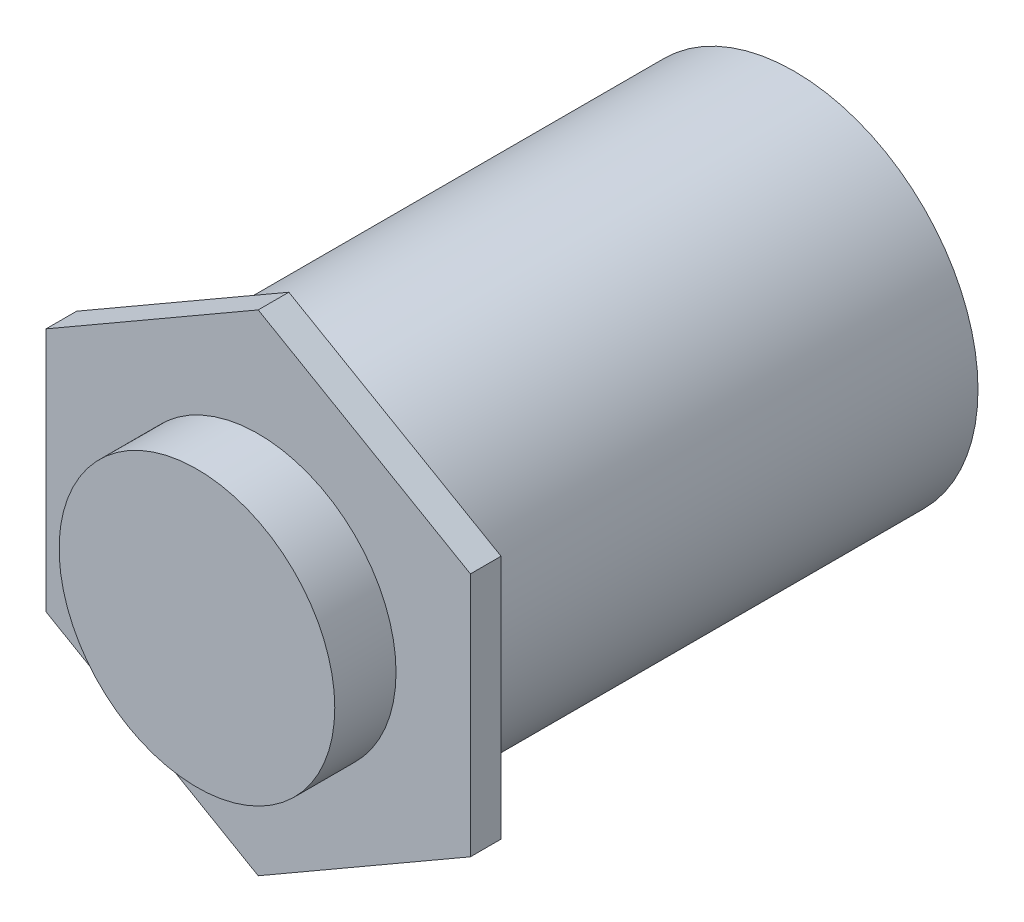
ISO-10303-21;
HEADER;
FILE_DESCRIPTION(('STEP AP214'),'2;1');
FILE_NAME('part.step','',(''),(''),'','','');
FILE_SCHEMA(('AUTOMOTIVE_DESIGN { 1 0 10303 214 1 1 1 1 }'));
ENDSEC;
DATA;
#1=APPLICATION_CONTEXT('core data for automotive mechanical design processes');
#2=APPLICATION_PROTOCOL_DEFINITION('international standard','automotive_design',2000,#1);
#3=PRODUCT_CONTEXT('',#1,'mechanical');
#4=PRODUCT('Part','Part','',(#3));
#5=PRODUCT_RELATED_PRODUCT_CATEGORY('part','',(#4));
#6=PRODUCT_DEFINITION_FORMATION('','',#4);
#7=PRODUCT_DEFINITION_CONTEXT('part definition',#1,'design');
#8=PRODUCT_DEFINITION('design','',#6,#7);
#9=PRODUCT_DEFINITION_SHAPE('','',#8);
#10=(LENGTH_UNIT() NAMED_UNIT(*) SI_UNIT(.MILLI.,.METRE.));
#11=(NAMED_UNIT(*) PLANE_ANGLE_UNIT() SI_UNIT($,.RADIAN.));
#12=(NAMED_UNIT(*) SI_UNIT($,.STERADIAN.) SOLID_ANGLE_UNIT());
#13=UNCERTAINTY_MEASURE_WITH_UNIT(LENGTH_MEASURE(1.E-05),#10,'distance_accuracy_value','');
#14=(GEOMETRIC_REPRESENTATION_CONTEXT(3) GLOBAL_UNCERTAINTY_ASSIGNED_CONTEXT((#13)) GLOBAL_UNIT_ASSIGNED_CONTEXT((#10,
#11,#12)) REPRESENTATION_CONTEXT('',''));
#15=CARTESIAN_POINT('',(0.,0.,0.));
#16=DIRECTION('',(0.,0.,1.));
#17=DIRECTION('',(1.,0.,0.));
#18=AXIS2_PLACEMENT_3D('',#15,#16,#17);
#19=CARTESIAN_POINT('',(0.,0.,16.5));
#20=DIRECTION('',(0.,0.,-1.));
#21=DIRECTION('',(-1.,0.,0.));
#22=AXIS2_PLACEMENT_3D('',#19,#20,#21);
#23=CYLINDRICAL_SURFACE('',#22,6.);
#24=CARTESIAN_POINT('',(0.,0.,16.5));
#25=DIRECTION('',(0.,0.,1.));
#26=DIRECTION('',(1.,0.,0.));
#27=AXIS2_PLACEMENT_3D('',#24,#25,#26);
#28=CIRCLE('',#27,6.);
#29=CARTESIAN_POINT('',(6.,0.,16.5));
#30=VERTEX_POINT('',#29);
#31=EDGE_CURVE('E52',#30,#30,#28,.T.);
#32=ORIENTED_EDGE('',*,*,#31,.F.);
#33=EDGE_LOOP('',(#32));
#34=FACE_BOUND('',#33,.T.);
#35=CARTESIAN_POINT('',(0.,0.,0.));
#36=DIRECTION('',(0.,0.,1.));
#37=DIRECTION('',(1.,0.,0.));
#38=AXIS2_PLACEMENT_3D('',#35,#36,#37);
#39=CIRCLE('',#38,6.);
#40=CARTESIAN_POINT('',(6.,0.,0.));
#41=VERTEX_POINT('',#40);
#42=EDGE_CURVE('E46',#41,#41,#39,.T.);
#43=ORIENTED_EDGE('',*,*,#42,.T.);
#44=EDGE_LOOP('',(#43));
#45=FACE_BOUND('',#44,.T.);
#46=ADVANCED_FACE('F43',(#34,#45),#23,.T.);
#47=CARTESIAN_POINT('',(0.,0.,0.));
#48=DIRECTION('',(0.,0.,1.));
#49=DIRECTION('',(1.,0.,0.));
#50=AXIS2_PLACEMENT_3D('',#47,#48,#49);
#51=PLANE('',#50);
#52=ORIENTED_EDGE('',*,*,#42,.F.);
#53=EDGE_LOOP('',(#52));
#54=FACE_BOUND('',#53,.T.);
#55=ADVANCED_FACE('F156',(#54),#51,.F.);
#56=CARTESIAN_POINT('',(6.92820323027551,4.00000000000001,17.5));
#57=DIRECTION('',(-0.5,-0.866025403784439,0.));
#58=DIRECTION('',(0.866025403784439,-0.5,0.));
#59=AXIS2_PLACEMENT_3D('',#56,#57,#58);
#60=PLANE('',#59);
#61=DIRECTION('',(-0.866025403784439,0.5,0.));
#62=VECTOR('',#61,1.);
#63=CARTESIAN_POINT('',(6.92820323027551,4.00000000000001,16.5));
#64=LINE('',#63,#62);
#65=CARTESIAN_POINT('',(6.92820323027551,4.00000000000001,16.5));
#66=VERTEX_POINT('',#65);
#67=CARTESIAN_POINT('',(0.,8.,16.5));
#68=VERTEX_POINT('',#67);
#69=EDGE_CURVE('E130',#66,#68,#64,.T.);
#70=ORIENTED_EDGE('',*,*,#69,.T.);
#71=DIRECTION('',(0.,0.,-1.));
#72=VECTOR('',#71,1.);
#73=CARTESIAN_POINT('',(0.,8.,17.5));
#74=LINE('',#73,#72);
#75=CARTESIAN_POINT('',(0.,8.,17.5));
#76=VERTEX_POINT('',#75);
#77=EDGE_CURVE('E148',#76,#68,#74,.T.);
#78=ORIENTED_EDGE('',*,*,#77,.F.);
#79=DIRECTION('',(-0.866025403784439,0.5,0.));
#80=VECTOR('',#79,1.);
#81=CARTESIAN_POINT('',(6.92820323027551,4.00000000000001,17.5));
#82=LINE('',#81,#80);
#83=CARTESIAN_POINT('',(6.92820323027551,4.00000000000001,17.5));
#84=VERTEX_POINT('',#83);
#85=EDGE_CURVE('E141',#84,#76,#82,.T.);
#86=ORIENTED_EDGE('',*,*,#85,.F.);
#87=DIRECTION('',(0.,0.,-1.));
#88=VECTOR('',#87,1.);
#89=CARTESIAN_POINT('',(6.92820323027551,4.00000000000001,17.5));
#90=LINE('',#89,#88);
#91=EDGE_CURVE('E126',#84,#66,#90,.T.);
#92=ORIENTED_EDGE('',*,*,#91,.T.);
#93=EDGE_LOOP('',(#70,#78,#86,#92));
#94=FACE_BOUND('',#93,.T.);
#95=ADVANCED_FACE('F158',(#94),#60,.F.);
#96=CARTESIAN_POINT('',(0.,8.,17.5));
#97=DIRECTION('',(0.5,-0.866025403784439,0.));
#98=DIRECTION('',(0.866025403784439,0.5,0.));
#99=AXIS2_PLACEMENT_3D('',#96,#97,#98);
#100=PLANE('',#99);
#101=DIRECTION('',(-0.866025403784439,-0.5,0.));
#102=VECTOR('',#101,1.);
#103=CARTESIAN_POINT('',(0.,8.,16.5));
#104=LINE('',#103,#102);
#105=CARTESIAN_POINT('',(-6.92820323027551,4.,16.5));
#106=VERTEX_POINT('',#105);
#107=EDGE_CURVE('E133',#68,#106,#104,.T.);
#108=ORIENTED_EDGE('',*,*,#107,.T.);
#109=DIRECTION('',(0.,0.,-1.));
#110=VECTOR('',#109,1.);
#111=CARTESIAN_POINT('',(-6.92820323027551,4.,17.5));
#112=LINE('',#111,#110);
#113=CARTESIAN_POINT('',(-6.92820323027551,4.,17.5));
#114=VERTEX_POINT('',#113);
#115=EDGE_CURVE('E145',#114,#106,#112,.T.);
#116=ORIENTED_EDGE('',*,*,#115,.F.);
#117=DIRECTION('',(-0.866025403784439,-0.5,0.));
#118=VECTOR('',#117,1.);
#119=CARTESIAN_POINT('',(0.,8.,17.5));
#120=LINE('',#119,#118);
#121=EDGE_CURVE('E99',#76,#114,#120,.T.);
#122=ORIENTED_EDGE('',*,*,#121,.F.);
#123=ORIENTED_EDGE('',*,*,#77,.T.);
#124=EDGE_LOOP('',(#108,#116,#122,#123));
#125=FACE_BOUND('',#124,.T.);
#126=ADVANCED_FACE('F163',(#125),#100,.F.);
#127=CARTESIAN_POINT('',(-6.92820323027551,4.,17.5));
#128=DIRECTION('',(1.,0.,0.));
#129=DIRECTION('',(0.,1.,0.));
#130=AXIS2_PLACEMENT_3D('',#127,#128,#129);
#131=PLANE('',#130);
#132=DIRECTION('',(0.,-1.,0.));
#133=VECTOR('',#132,1.);
#134=CARTESIAN_POINT('',(-6.92820323027551,4.,16.5));
#135=LINE('',#134,#133);
#136=CARTESIAN_POINT('',(-6.92820323027551,-4.,16.5));
#137=VERTEX_POINT('',#136);
#138=EDGE_CURVE('E136',#106,#137,#135,.T.);
#139=ORIENTED_EDGE('',*,*,#138,.T.);
#140=DIRECTION('',(0.,0.,-1.));
#141=VECTOR('',#140,1.);
#142=CARTESIAN_POINT('',(-6.92820323027551,-4.,17.5));
#143=LINE('',#142,#141);
#144=CARTESIAN_POINT('',(-6.92820323027551,-4.,17.5));
#145=VERTEX_POINT('',#144);
#146=EDGE_CURVE('E121',#145,#137,#143,.T.);
#147=ORIENTED_EDGE('',*,*,#146,.F.);
#148=DIRECTION('',(0.,-1.,0.));
#149=VECTOR('',#148,1.);
#150=CARTESIAN_POINT('',(-6.92820323027551,4.,17.5));
#151=LINE('',#150,#149);
#152=EDGE_CURVE('E112',#114,#145,#151,.T.);
#153=ORIENTED_EDGE('',*,*,#152,.F.);
#154=ORIENTED_EDGE('',*,*,#115,.T.);
#155=EDGE_LOOP('',(#139,#147,#153,#154));
#156=FACE_BOUND('',#155,.T.);
#157=ADVANCED_FACE('F170',(#156),#131,.F.);
#158=CARTESIAN_POINT('',(-6.92820323027551,-4.,17.5));
#159=DIRECTION('',(0.5,0.866025403784439,0.));
#160=DIRECTION('',(-0.866025403784439,0.5,0.));
#161=AXIS2_PLACEMENT_3D('',#158,#159,#160);
#162=PLANE('',#161);
#163=DIRECTION('',(0.866025403784439,-0.5,0.));
#164=VECTOR('',#163,1.);
#165=CARTESIAN_POINT('',(-6.92820323027551,-4.,16.5));
#166=LINE('',#165,#164);
#167=CARTESIAN_POINT('',(0.,-8.,16.5));
#168=VERTEX_POINT('',#167);
#169=EDGE_CURVE('E120',#137,#168,#166,.T.);
#170=ORIENTED_EDGE('',*,*,#169,.T.);
#171=DIRECTION('',(0.,0.,-1.));
#172=VECTOR('',#171,1.);
#173=CARTESIAN_POINT('',(0.,-8.,17.5));
#174=LINE('',#173,#172);
#175=CARTESIAN_POINT('',(0.,-8.,17.5));
#176=VERTEX_POINT('',#175);
#177=EDGE_CURVE('E117',#176,#168,#174,.T.);
#178=ORIENTED_EDGE('',*,*,#177,.F.);
#179=DIRECTION('',(0.866025403784439,-0.5,0.));
#180=VECTOR('',#179,1.);
#181=CARTESIAN_POINT('',(-6.92820323027551,-4.,17.5));
#182=LINE('',#181,#180);
#183=EDGE_CURVE('E106',#145,#176,#182,.T.);
#184=ORIENTED_EDGE('',*,*,#183,.F.);
#185=ORIENTED_EDGE('',*,*,#146,.T.);
#186=EDGE_LOOP('',(#170,#178,#184,#185));
#187=FACE_BOUND('',#186,.T.);
#188=ADVANCED_FACE('F118',(#187),#162,.F.);
#189=CARTESIAN_POINT('',(0.,-8.,17.5));
#190=DIRECTION('',(-0.5,0.866025403784439,0.));
#191=DIRECTION('',(-0.866025403784439,-0.5,0.));
#192=AXIS2_PLACEMENT_3D('',#189,#190,#191);
#193=PLANE('',#192);
#194=DIRECTION('',(0.866025403784439,0.5,0.));
#195=VECTOR('',#194,1.);
#196=CARTESIAN_POINT('',(0.,-8.,16.5));
#197=LINE('',#196,#195);
#198=CARTESIAN_POINT('',(6.92820323027551,-4.,16.5));
#199=VERTEX_POINT('',#198);
#200=EDGE_CURVE('E84',#168,#199,#197,.T.);
#201=ORIENTED_EDGE('',*,*,#200,.T.);
#202=DIRECTION('',(0.,0.,-1.));
#203=VECTOR('',#202,1.);
#204=CARTESIAN_POINT('',(6.92820323027551,-4.,17.5));
#205=LINE('',#204,#203);
#206=CARTESIAN_POINT('',(6.92820323027551,-4.,17.5));
#207=VERTEX_POINT('',#206);
#208=EDGE_CURVE('E122',#207,#199,#205,.T.);
#209=ORIENTED_EDGE('',*,*,#208,.F.);
#210=DIRECTION('',(0.866025403784439,0.5,0.));
#211=VECTOR('',#210,1.);
#212=CARTESIAN_POINT('',(0.,-8.,17.5));
#213=LINE('',#212,#211);
#214=EDGE_CURVE('E110',#176,#207,#213,.T.);
#215=ORIENTED_EDGE('',*,*,#214,.F.);
#216=ORIENTED_EDGE('',*,*,#177,.T.);
#217=EDGE_LOOP('',(#201,#209,#215,#216));
#218=FACE_BOUND('',#217,.T.);
#219=ADVANCED_FACE('F124',(#218),#193,.F.);
#220=CARTESIAN_POINT('',(6.92820323027551,-4.,17.5));
#221=DIRECTION('',(-1.,0.,0.));
#222=DIRECTION('',(0.,-1.,0.));
#223=AXIS2_PLACEMENT_3D('',#220,#221,#222);
#224=PLANE('',#223);
#225=DIRECTION('',(0.,1.,0.));
#226=VECTOR('',#225,1.);
#227=CARTESIAN_POINT('',(6.92820323027551,-4.,16.5));
#228=LINE('',#227,#226);
#229=EDGE_CURVE('E90',#199,#66,#228,.T.);
#230=ORIENTED_EDGE('',*,*,#229,.T.);
#231=ORIENTED_EDGE('',*,*,#91,.F.);
#232=DIRECTION('',(0.,1.,0.));
#233=VECTOR('',#232,1.);
#234=CARTESIAN_POINT('',(6.92820323027551,-4.,17.5));
#235=LINE('',#234,#233);
#236=EDGE_CURVE('E61',#207,#84,#235,.T.);
#237=ORIENTED_EDGE('',*,*,#236,.F.);
#238=ORIENTED_EDGE('',*,*,#208,.T.);
#239=EDGE_LOOP('',(#230,#231,#237,#238));
#240=FACE_BOUND('',#239,.T.);
#241=ADVANCED_FACE('F178',(#240),#224,.F.);
#242=CARTESIAN_POINT('',(0.,0.,17.5));
#243=DIRECTION('',(0.,0.,1.));
#244=DIRECTION('',(1.,0.,0.));
#245=AXIS2_PLACEMENT_3D('',#242,#243,#244);
#246=PLANE('',#245);
#247=CARTESIAN_POINT('',(0.,0.,17.5));
#248=DIRECTION('',(0.,0.,1.));
#249=DIRECTION('',(1.,0.,0.));
#250=AXIS2_PLACEMENT_3D('',#247,#248,#249);
#251=CIRCLE('',#250,4.5);
#252=CARTESIAN_POINT('',(4.5,0.,17.5));
#253=VERTEX_POINT('',#252);
#254=EDGE_CURVE('E11',#253,#253,#251,.T.);
#255=ORIENTED_EDGE('',*,*,#254,.F.);
#256=EDGE_LOOP('',(#255));
#257=FACE_BOUND('',#256,.T.);
#258=ORIENTED_EDGE('',*,*,#85,.T.);
#259=ORIENTED_EDGE('',*,*,#121,.T.);
#260=ORIENTED_EDGE('',*,*,#152,.T.);
#261=ORIENTED_EDGE('',*,*,#183,.T.);
#262=ORIENTED_EDGE('',*,*,#214,.T.);
#263=ORIENTED_EDGE('',*,*,#236,.T.);
#264=EDGE_LOOP('',(#258,#259,#260,#261,#262,#263));
#265=FACE_BOUND('',#264,.T.);
#266=ADVANCED_FACE('F108',(#257,#265),#246,.T.);
#267=CARTESIAN_POINT('',(0.,0.,16.5));
#268=DIRECTION('',(0.,0.,1.));
#269=DIRECTION('',(1.,0.,0.));
#270=AXIS2_PLACEMENT_3D('',#267,#268,#269);
#271=PLANE('',#270);
#272=ORIENTED_EDGE('',*,*,#31,.T.);
#273=EDGE_LOOP('',(#272));
#274=FACE_BOUND('',#273,.T.);
#275=ORIENTED_EDGE('',*,*,#69,.F.);
#276=ORIENTED_EDGE('',*,*,#229,.F.);
#277=ORIENTED_EDGE('',*,*,#200,.F.);
#278=ORIENTED_EDGE('',*,*,#169,.F.);
#279=ORIENTED_EDGE('',*,*,#138,.F.);
#280=ORIENTED_EDGE('',*,*,#107,.F.);
#281=EDGE_LOOP('',(#275,#276,#277,#278,#279,#280));
#282=FACE_BOUND('',#281,.T.);
#283=ADVANCED_FACE('F181',(#274,#282),#271,.F.);
#284=CARTESIAN_POINT('',(0.,0.,19.5));
#285=DIRECTION('',(0.,0.,-1.));
#286=DIRECTION('',(-1.,0.,0.));
#287=AXIS2_PLACEMENT_3D('',#284,#285,#286);
#288=CYLINDRICAL_SURFACE('',#287,4.5);
#289=CARTESIAN_POINT('',(0.,0.,19.5));
#290=DIRECTION('',(0.,0.,1.));
#291=DIRECTION('',(1.,0.,0.));
#292=AXIS2_PLACEMENT_3D('',#289,#290,#291);
#293=CIRCLE('',#292,4.5);
#294=CARTESIAN_POINT('',(4.5,0.,19.5));
#295=VERTEX_POINT('',#294);
#296=EDGE_CURVE('E134',#295,#295,#293,.T.);
#297=ORIENTED_EDGE('',*,*,#296,.F.);
#298=EDGE_LOOP('',(#297));
#299=FACE_BOUND('',#298,.T.);
#300=ORIENTED_EDGE('',*,*,#254,.T.);
#301=EDGE_LOOP('',(#300));
#302=FACE_BOUND('',#301,.T.);
#303=ADVANCED_FACE('F184',(#299,#302),#288,.T.);
#304=CARTESIAN_POINT('',(0.,0.,19.5));
#305=DIRECTION('',(0.,0.,1.));
#306=DIRECTION('',(1.,0.,0.));
#307=AXIS2_PLACEMENT_3D('',#304,#305,#306);
#308=PLANE('',#307);
#309=ORIENTED_EDGE('',*,*,#296,.T.);
#310=EDGE_LOOP('',(#309));
#311=FACE_BOUND('',#310,.T.);
#312=ADVANCED_FACE('F190',(#311),#308,.T.);
#313=CLOSED_SHELL('',(#46,#55,#95,#126,#157,#188,#219,#241,#266,#283,#303,#312));
#314=MANIFOLD_SOLID_BREP('B2',#313);
#315=ADVANCED_BREP_SHAPE_REPRESENTATION('',(#18,#314),#14);
#316=SHAPE_DEFINITION_REPRESENTATION(#9,#315);
ENDSEC;
END-ISO-10303-21;
